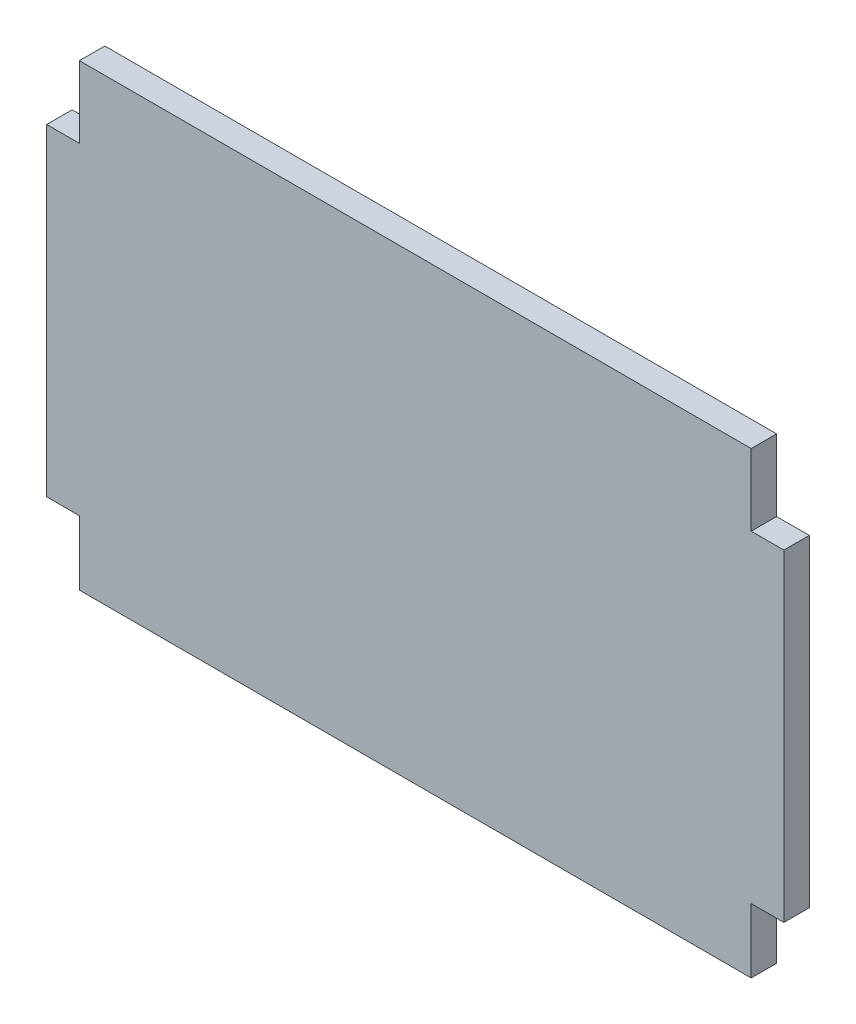
ISO-10303-21;
HEADER;
FILE_DESCRIPTION(('STEP AP214'),'2;1');
FILE_NAME('part.step','',(''),(''),'','','');
FILE_SCHEMA(('AUTOMOTIVE_DESIGN { 1 0 10303 214 1 1 1 1 }'));
ENDSEC;
DATA;
#1=APPLICATION_CONTEXT('core data for automotive mechanical design processes');
#2=APPLICATION_PROTOCOL_DEFINITION('international standard','automotive_design',2000,#1);
#3=PRODUCT_CONTEXT('',#1,'mechanical');
#4=PRODUCT('Part','Part','',(#3));
#5=PRODUCT_RELATED_PRODUCT_CATEGORY('part','',(#4));
#6=PRODUCT_DEFINITION_FORMATION('','',#4);
#7=PRODUCT_DEFINITION_CONTEXT('part definition',#1,'design');
#8=PRODUCT_DEFINITION('design','',#6,#7);
#9=PRODUCT_DEFINITION_SHAPE('','',#8);
#10=(LENGTH_UNIT() NAMED_UNIT(*) SI_UNIT(.MILLI.,.METRE.));
#11=(NAMED_UNIT(*) PLANE_ANGLE_UNIT() SI_UNIT($,.RADIAN.));
#12=(NAMED_UNIT(*) SI_UNIT($,.STERADIAN.) SOLID_ANGLE_UNIT());
#13=UNCERTAINTY_MEASURE_WITH_UNIT(LENGTH_MEASURE(1.E-05),#10,'distance_accuracy_value','');
#14=(GEOMETRIC_REPRESENTATION_CONTEXT(3) GLOBAL_UNCERTAINTY_ASSIGNED_CONTEXT((#13)) GLOBAL_UNIT_ASSIGNED_CONTEXT((#10,
#11,#12)) REPRESENTATION_CONTEXT('',''));
#15=CARTESIAN_POINT('',(0.,0.,0.));
#16=DIRECTION('',(0.,0.,1.));
#17=DIRECTION('',(1.,0.,0.));
#18=AXIS2_PLACEMENT_3D('',#15,#16,#17);
#19=CARTESIAN_POINT('',(-79.0312101910828,49.1611464968153,7.));
#20=DIRECTION('',(1.,0.,0.));
#21=DIRECTION('',(0.,0.,-1.));
#22=AXIS2_PLACEMENT_3D('',#19,#20,#21);
#23=PLANE('',#22);
#24=DIRECTION('',(0.,-1.,0.));
#25=VECTOR('',#24,1.);
#26=CARTESIAN_POINT('',(-79.0312101910828,49.1611464968153,0.));
#27=LINE('',#26,#25);
#28=CARTESIAN_POINT('',(-79.0312101910828,29.4234534047649,0.));
#29=VERTEX_POINT('',#28);
#30=CARTESIAN_POINT('',(-79.0312101910828,-59.4765465952351,0.));
#31=VERTEX_POINT('',#30);
#32=EDGE_CURVE('E205',#29,#31,#27,.T.);
#33=ORIENTED_EDGE('',*,*,#32,.T.);
#34=DIRECTION('',(0.,0.,1.));
#35=VECTOR('',#34,1.);
#36=CARTESIAN_POINT('',(-79.0312101910828,-59.4765465952351,-21.6927759541275));
#37=LINE('',#36,#35);
#38=CARTESIAN_POINT('',(-79.0312101910828,-59.4765465952351,7.));
#39=VERTEX_POINT('',#38);
#40=EDGE_CURVE('E252',#31,#39,#37,.T.);
#41=ORIENTED_EDGE('',*,*,#40,.T.);
#42=DIRECTION('',(0.,-1.,0.));
#43=VECTOR('',#42,1.);
#44=CARTESIAN_POINT('',(-79.0312101910828,49.1611464968153,7.));
#45=LINE('',#44,#43);
#46=CARTESIAN_POINT('',(-79.0312101910828,29.4234534047649,7.));
#47=VERTEX_POINT('',#46);
#48=EDGE_CURVE('E206',#47,#39,#45,.T.);
#49=ORIENTED_EDGE('',*,*,#48,.F.);
#50=DIRECTION('',(0.,0.,1.));
#51=VECTOR('',#50,1.);
#52=CARTESIAN_POINT('',(-79.0312101910828,29.4234534047649,-21.6927759541275));
#53=LINE('',#52,#51);
#54=EDGE_CURVE('E147',#29,#47,#53,.T.);
#55=ORIENTED_EDGE('',*,*,#54,.F.);
#56=EDGE_LOOP('',(#33,#41,#49,#55));
#57=FACE_BOUND('',#56,.T.);
#58=ADVANCED_FACE('F37',(#57),#23,.F.);
#59=CARTESIAN_POINT('',(-79.0312101910828,-77.2388535031847,7.));
#60=DIRECTION('',(0.,1.,0.));
#61=DIRECTION('',(0.,0.,1.));
#62=AXIS2_PLACEMENT_3D('',#59,#60,#61);
#63=PLANE('',#62);
#64=DIRECTION('',(1.,0.,0.));
#65=VECTOR('',#64,1.);
#66=CARTESIAN_POINT('',(-79.0312101910828,-77.2388535031847,7.));
#67=LINE('',#66,#65);
#68=CARTESIAN_POINT('',(-70.0312101910829,-77.2388535031847,7.));
#69=VERTEX_POINT('',#68);
#70=CARTESIAN_POINT('',(115.168789808917,-77.2388535031847,7.));
#71=VERTEX_POINT('',#70);
#72=EDGE_CURVE('E210',#69,#71,#67,.T.);
#73=ORIENTED_EDGE('',*,*,#72,.F.);
#74=DIRECTION('',(0.,0.,1.));
#75=VECTOR('',#74,1.);
#76=CARTESIAN_POINT('',(-70.0312101910829,-77.2388535031847,-21.6927759541275));
#77=LINE('',#76,#75);
#78=CARTESIAN_POINT('',(-70.0312101910829,-77.2388535031847,0.));
#79=VERTEX_POINT('',#78);
#80=EDGE_CURVE('E256',#79,#69,#77,.T.);
#81=ORIENTED_EDGE('',*,*,#80,.F.);
#82=DIRECTION('',(1.,0.,0.));
#83=VECTOR('',#82,1.);
#84=CARTESIAN_POINT('',(-79.0312101910828,-77.2388535031847,0.));
#85=LINE('',#84,#83);
#86=CARTESIAN_POINT('',(115.168789808917,-77.2388535031847,0.));
#87=VERTEX_POINT('',#86);
#88=EDGE_CURVE('E219',#79,#87,#85,.T.);
#89=ORIENTED_EDGE('',*,*,#88,.T.);
#90=DIRECTION('',(0.,0.,1.));
#91=VECTOR('',#90,1.);
#92=CARTESIAN_POINT('',(115.168789808917,-77.2388535031847,-21.6927759541275));
#93=LINE('',#92,#91);
#94=EDGE_CURVE('E185',#87,#71,#93,.T.);
#95=ORIENTED_EDGE('',*,*,#94,.T.);
#96=EDGE_LOOP('',(#73,#81,#89,#95));
#97=FACE_BOUND('',#96,.T.);
#98=ADVANCED_FACE('F290',(#97),#63,.F.);
#99=CARTESIAN_POINT('',(124.168789808917,49.1611464968153,7.));
#100=DIRECTION('',(-1.,0.,0.));
#101=DIRECTION('',(0.,-1.,0.));
#102=AXIS2_PLACEMENT_3D('',#99,#100,#101);
#103=PLANE('',#102);
#104=DIRECTION('',(0.,1.,0.));
#105=VECTOR('',#104,1.);
#106=CARTESIAN_POINT('',(124.168789808917,49.1611464968153,0.));
#107=LINE('',#106,#105);
#108=CARTESIAN_POINT('',(124.168789808917,-59.4765465952351,0.));
#109=VERTEX_POINT('',#108);
#110=CARTESIAN_POINT('',(124.168789808917,29.4234534047649,0.));
#111=VERTEX_POINT('',#110);
#112=EDGE_CURVE('E222',#109,#111,#107,.T.);
#113=ORIENTED_EDGE('',*,*,#112,.T.);
#114=DIRECTION('',(0.,0.,1.));
#115=VECTOR('',#114,1.);
#116=CARTESIAN_POINT('',(124.168789808917,29.4234534047649,-21.6927759541275));
#117=LINE('',#116,#115);
#118=CARTESIAN_POINT('',(124.168789808917,29.4234534047649,7.));
#119=VERTEX_POINT('',#118);
#120=EDGE_CURVE('E172',#111,#119,#117,.T.);
#121=ORIENTED_EDGE('',*,*,#120,.T.);
#122=DIRECTION('',(0.,1.,0.));
#123=VECTOR('',#122,1.);
#124=CARTESIAN_POINT('',(124.168789808917,49.1611464968153,7.));
#125=LINE('',#124,#123);
#126=CARTESIAN_POINT('',(124.168789808917,-59.4765465952351,7.));
#127=VERTEX_POINT('',#126);
#128=EDGE_CURVE('E46',#127,#119,#125,.T.);
#129=ORIENTED_EDGE('',*,*,#128,.F.);
#130=DIRECTION('',(0.,0.,1.));
#131=VECTOR('',#130,1.);
#132=CARTESIAN_POINT('',(124.168789808917,-59.4765465952351,-21.6927759541275));
#133=LINE('',#132,#131);
#134=EDGE_CURVE('E194',#109,#127,#133,.T.);
#135=ORIENTED_EDGE('',*,*,#134,.F.);
#136=EDGE_LOOP('',(#113,#121,#129,#135));
#137=FACE_BOUND('',#136,.T.);
#138=ADVANCED_FACE('F232',(#137),#103,.F.);
#139=CARTESIAN_POINT('',(-79.0312101910828,49.1611464968153,7.));
#140=DIRECTION('',(0.,-1.,0.));
#141=DIRECTION('',(0.,0.,-1.));
#142=AXIS2_PLACEMENT_3D('',#139,#140,#141);
#143=PLANE('',#142);
#144=DIRECTION('',(-1.,0.,0.));
#145=VECTOR('',#144,1.);
#146=CARTESIAN_POINT('',(-79.0312101910828,49.1611464968153,7.));
#147=LINE('',#146,#145);
#148=CARTESIAN_POINT('',(115.168789808917,49.1611464968153,7.));
#149=VERTEX_POINT('',#148);
#150=CARTESIAN_POINT('',(-70.0312101910828,49.1611464968153,7.));
#151=VERTEX_POINT('',#150);
#152=EDGE_CURVE('E11',#149,#151,#147,.T.);
#153=ORIENTED_EDGE('',*,*,#152,.F.);
#154=DIRECTION('',(0.,0.,1.));
#155=VECTOR('',#154,1.);
#156=CARTESIAN_POINT('',(115.168789808917,49.1611464968153,-21.6927759541275));
#157=LINE('',#156,#155);
#158=CARTESIAN_POINT('',(115.168789808917,49.1611464968153,0.));
#159=VERTEX_POINT('',#158);
#160=EDGE_CURVE('E163',#159,#149,#157,.T.);
#161=ORIENTED_EDGE('',*,*,#160,.F.);
#162=DIRECTION('',(-1.,0.,0.));
#163=VECTOR('',#162,1.);
#164=CARTESIAN_POINT('',(-79.0312101910828,49.1611464968153,0.));
#165=LINE('',#164,#163);
#166=CARTESIAN_POINT('',(-70.0312101910828,49.1611464968153,0.));
#167=VERTEX_POINT('',#166);
#168=EDGE_CURVE('E40',#159,#167,#165,.T.);
#169=ORIENTED_EDGE('',*,*,#168,.T.);
#170=DIRECTION('',(0.,0.,1.));
#171=VECTOR('',#170,1.);
#172=CARTESIAN_POINT('',(-70.0312101910828,49.1611464968153,-21.6927759541275));
#173=LINE('',#172,#171);
#174=EDGE_CURVE('E131',#167,#151,#173,.T.);
#175=ORIENTED_EDGE('',*,*,#174,.T.);
#176=EDGE_LOOP('',(#153,#161,#169,#175));
#177=FACE_BOUND('',#176,.T.);
#178=ADVANCED_FACE('F143',(#177),#143,.F.);
#179=CARTESIAN_POINT('',(0.,0.,7.));
#180=DIRECTION('',(0.,0.,1.));
#181=DIRECTION('',(1.,0.,0.));
#182=AXIS2_PLACEMENT_3D('',#179,#180,#181);
#183=PLANE('',#182);
#184=DIRECTION('',(-1.,0.,0.));
#185=VECTOR('',#184,1.);
#186=CARTESIAN_POINT('',(-70.0312101910828,-59.4765465952351,7.));
#187=LINE('',#186,#185);
#188=CARTESIAN_POINT('',(-70.0312101910828,-59.4765465952351,7.));
#189=VERTEX_POINT('',#188);
#190=EDGE_CURVE('E243',#189,#39,#187,.T.);
#191=ORIENTED_EDGE('',*,*,#190,.F.);
#192=DIRECTION('',(0.,1.,0.));
#193=VECTOR('',#192,1.);
#194=CARTESIAN_POINT('',(-70.0312101910828,-59.4765465952351,7.));
#195=LINE('',#194,#193);
#196=EDGE_CURVE('E247',#69,#189,#195,.T.);
#197=ORIENTED_EDGE('',*,*,#196,.F.);
#198=ORIENTED_EDGE('',*,*,#72,.T.);
#199=DIRECTION('',(0.,-1.,0.));
#200=VECTOR('',#199,1.);
#201=CARTESIAN_POINT('',(115.168789808917,-59.4765465952351,7.));
#202=LINE('',#201,#200);
#203=CARTESIAN_POINT('',(115.168789808917,-59.4765465952351,7.));
#204=VERTEX_POINT('',#203);
#205=EDGE_CURVE('E190',#204,#71,#202,.T.);
#206=ORIENTED_EDGE('',*,*,#205,.F.);
#207=DIRECTION('',(-1.,0.,0.));
#208=VECTOR('',#207,1.);
#209=CARTESIAN_POINT('',(115.168789808917,-59.4765465952351,7.));
#210=LINE('',#209,#208);
#211=EDGE_CURVE('E186',#127,#204,#210,.T.);
#212=ORIENTED_EDGE('',*,*,#211,.F.);
#213=ORIENTED_EDGE('',*,*,#128,.T.);
#214=DIRECTION('',(1.,0.,0.));
#215=VECTOR('',#214,1.);
#216=CARTESIAN_POINT('',(115.168789808917,29.4234534047649,7.));
#217=LINE('',#216,#215);
#218=CARTESIAN_POINT('',(115.168789808917,29.4234534047649,7.));
#219=VERTEX_POINT('',#218);
#220=EDGE_CURVE('E155',#219,#119,#217,.T.);
#221=ORIENTED_EDGE('',*,*,#220,.F.);
#222=DIRECTION('',(0.,-1.,0.));
#223=VECTOR('',#222,1.);
#224=CARTESIAN_POINT('',(115.168789808917,29.4234534047649,7.));
#225=LINE('',#224,#223);
#226=EDGE_CURVE('E153',#149,#219,#225,.T.);
#227=ORIENTED_EDGE('',*,*,#226,.F.);
#228=ORIENTED_EDGE('',*,*,#152,.T.);
#229=DIRECTION('',(0.,1.,0.));
#230=VECTOR('',#229,1.);
#231=CARTESIAN_POINT('',(-70.0312101910828,29.4234534047649,7.));
#232=LINE('',#231,#230);
#233=CARTESIAN_POINT('',(-70.0312101910828,29.4234534047649,7.));
#234=VERTEX_POINT('',#233);
#235=EDGE_CURVE('E127',#234,#151,#232,.T.);
#236=ORIENTED_EDGE('',*,*,#235,.F.);
#237=DIRECTION('',(1.,0.,0.));
#238=VECTOR('',#237,1.);
#239=CARTESIAN_POINT('',(-70.0312101910828,29.4234534047649,7.));
#240=LINE('',#239,#238);
#241=EDGE_CURVE('E138',#47,#234,#240,.T.);
#242=ORIENTED_EDGE('',*,*,#241,.F.);
#243=ORIENTED_EDGE('',*,*,#48,.T.);
#244=EDGE_LOOP('',(#191,#197,#198,#206,#212,#213,#221,#227,#228,#236,#242,#243));
#245=FACE_BOUND('',#244,.T.);
#246=ADVANCED_FACE('F151',(#245),#183,.T.);
#247=CARTESIAN_POINT('',(0.,0.,0.));
#248=DIRECTION('',(0.,0.,1.));
#249=DIRECTION('',(1.,0.,0.));
#250=AXIS2_PLACEMENT_3D('',#247,#248,#249);
#251=PLANE('',#250);
#252=DIRECTION('',(0.,-1.,0.));
#253=VECTOR('',#252,1.);
#254=CARTESIAN_POINT('',(-70.0312101910828,-59.4765465952351,0.));
#255=LINE('',#254,#253);
#256=CARTESIAN_POINT('',(-70.0312101910828,-59.4765465952351,0.));
#257=VERTEX_POINT('',#256);
#258=EDGE_CURVE('E261',#257,#79,#255,.T.);
#259=ORIENTED_EDGE('',*,*,#258,.F.);
#260=DIRECTION('',(1.,0.,0.));
#261=VECTOR('',#260,1.);
#262=CARTESIAN_POINT('',(-70.0312101910828,-59.4765465952351,0.));
#263=LINE('',#262,#261);
#264=EDGE_CURVE('E191',#31,#257,#263,.T.);
#265=ORIENTED_EDGE('',*,*,#264,.F.);
#266=ORIENTED_EDGE('',*,*,#32,.F.);
#267=DIRECTION('',(-1.,0.,0.));
#268=VECTOR('',#267,1.);
#269=CARTESIAN_POINT('',(-70.0312101910828,29.4234534047649,0.));
#270=LINE('',#269,#268);
#271=CARTESIAN_POINT('',(-70.0312101910828,29.4234534047649,0.));
#272=VERTEX_POINT('',#271);
#273=EDGE_CURVE('E166',#272,#29,#270,.T.);
#274=ORIENTED_EDGE('',*,*,#273,.F.);
#275=DIRECTION('',(0.,-1.,0.));
#276=VECTOR('',#275,1.);
#277=CARTESIAN_POINT('',(-70.0312101910828,29.4234534047649,0.));
#278=LINE('',#277,#276);
#279=EDGE_CURVE('E157',#167,#272,#278,.T.);
#280=ORIENTED_EDGE('',*,*,#279,.F.);
#281=ORIENTED_EDGE('',*,*,#168,.F.);
#282=DIRECTION('',(0.,1.,0.));
#283=VECTOR('',#282,1.);
#284=CARTESIAN_POINT('',(115.168789808917,29.4234534047649,0.));
#285=LINE('',#284,#283);
#286=CARTESIAN_POINT('',(115.168789808917,29.4234534047649,0.));
#287=VERTEX_POINT('',#286);
#288=EDGE_CURVE('E176',#287,#159,#285,.T.);
#289=ORIENTED_EDGE('',*,*,#288,.F.);
#290=DIRECTION('',(-1.,0.,0.));
#291=VECTOR('',#290,1.);
#292=CARTESIAN_POINT('',(115.168789808917,29.4234534047649,0.));
#293=LINE('',#292,#291);
#294=EDGE_CURVE('E169',#111,#287,#293,.T.);
#295=ORIENTED_EDGE('',*,*,#294,.F.);
#296=ORIENTED_EDGE('',*,*,#112,.F.);
#297=DIRECTION('',(1.,0.,0.));
#298=VECTOR('',#297,1.);
#299=CARTESIAN_POINT('',(115.168789808917,-59.4765465952351,0.));
#300=LINE('',#299,#298);
#301=CARTESIAN_POINT('',(115.168789808917,-59.4765465952351,0.));
#302=VERTEX_POINT('',#301);
#303=EDGE_CURVE('E184',#302,#109,#300,.T.);
#304=ORIENTED_EDGE('',*,*,#303,.F.);
#305=DIRECTION('',(0.,1.,0.));
#306=VECTOR('',#305,1.);
#307=CARTESIAN_POINT('',(115.168789808917,-59.4765465952351,0.));
#308=LINE('',#307,#306);
#309=EDGE_CURVE('E180',#87,#302,#308,.T.);
#310=ORIENTED_EDGE('',*,*,#309,.F.);
#311=ORIENTED_EDGE('',*,*,#88,.F.);
#312=EDGE_LOOP('',(#259,#265,#266,#274,#280,#281,#289,#295,#296,#304,#310,#311));
#313=FACE_BOUND('',#312,.T.);
#314=ADVANCED_FACE('F238',(#313),#251,.F.);
#315=CARTESIAN_POINT('',(115.168789808917,-59.4765465952351,-21.6927759541275));
#316=DIRECTION('',(-1.,0.,0.));
#317=DIRECTION('',(0.,0.,1.));
#318=AXIS2_PLACEMENT_3D('',#315,#316,#317);
#319=PLANE('',#318);
#320=ORIENTED_EDGE('',*,*,#309,.T.);
#321=DIRECTION('',(0.,0.,1.));
#322=VECTOR('',#321,1.);
#323=CARTESIAN_POINT('',(115.168789808917,-59.4765465952351,-21.6927759541275));
#324=LINE('',#323,#322);
#325=EDGE_CURVE('E198',#302,#204,#324,.T.);
#326=ORIENTED_EDGE('',*,*,#325,.T.);
#327=ORIENTED_EDGE('',*,*,#205,.T.);
#328=ORIENTED_EDGE('',*,*,#94,.F.);
#329=EDGE_LOOP('',(#320,#326,#327,#328));
#330=FACE_BOUND('',#329,.T.);
#331=ADVANCED_FACE('F292',(#330),#319,.F.);
#332=CARTESIAN_POINT('',(115.168789808917,-59.4765465952351,-21.6927759541275));
#333=DIRECTION('',(0.,1.,0.));
#334=DIRECTION('',(-1.,0.,0.));
#335=AXIS2_PLACEMENT_3D('',#332,#333,#334);
#336=PLANE('',#335);
#337=ORIENTED_EDGE('',*,*,#303,.T.);
#338=ORIENTED_EDGE('',*,*,#134,.T.);
#339=ORIENTED_EDGE('',*,*,#211,.T.);
#340=ORIENTED_EDGE('',*,*,#325,.F.);
#341=EDGE_LOOP('',(#337,#338,#339,#340));
#342=FACE_BOUND('',#341,.T.);
#343=ADVANCED_FACE('F295',(#342),#336,.F.);
#344=CARTESIAN_POINT('',(-70.0312101910828,29.4234534047649,-21.6927759541275));
#345=DIRECTION('',(1.,0.,0.));
#346=DIRECTION('',(0.,0.,-1.));
#347=AXIS2_PLACEMENT_3D('',#344,#345,#346);
#348=PLANE('',#347);
#349=ORIENTED_EDGE('',*,*,#279,.T.);
#350=DIRECTION('',(0.,0.,1.));
#351=VECTOR('',#350,1.);
#352=CARTESIAN_POINT('',(-70.0312101910828,29.4234534047649,-21.6927759541275));
#353=LINE('',#352,#351);
#354=EDGE_CURVE('E133',#272,#234,#353,.T.);
#355=ORIENTED_EDGE('',*,*,#354,.T.);
#356=ORIENTED_EDGE('',*,*,#235,.T.);
#357=ORIENTED_EDGE('',*,*,#174,.F.);
#358=EDGE_LOOP('',(#349,#355,#356,#357));
#359=FACE_BOUND('',#358,.T.);
#360=ADVANCED_FACE('F130',(#359),#348,.F.);
#361=CARTESIAN_POINT('',(-70.0312101910828,29.4234534047649,-21.6927759541275));
#362=DIRECTION('',(0.,-1.,0.));
#363=DIRECTION('',(1.,0.,0.));
#364=AXIS2_PLACEMENT_3D('',#361,#362,#363);
#365=PLANE('',#364);
#366=ORIENTED_EDGE('',*,*,#273,.T.);
#367=ORIENTED_EDGE('',*,*,#54,.T.);
#368=ORIENTED_EDGE('',*,*,#241,.T.);
#369=ORIENTED_EDGE('',*,*,#354,.F.);
#370=EDGE_LOOP('',(#366,#367,#368,#369));
#371=FACE_BOUND('',#370,.T.);
#372=ADVANCED_FACE('F277',(#371),#365,.F.);
#373=CARTESIAN_POINT('',(115.168789808917,29.4234534047649,-21.6927759541275));
#374=DIRECTION('',(0.,-1.,0.));
#375=DIRECTION('',(1.,0.,0.));
#376=AXIS2_PLACEMENT_3D('',#373,#374,#375);
#377=PLANE('',#376);
#378=ORIENTED_EDGE('',*,*,#294,.T.);
#379=DIRECTION('',(0.,0.,1.));
#380=VECTOR('',#379,1.);
#381=CARTESIAN_POINT('',(115.168789808917,29.4234534047649,-21.6927759541275));
#382=LINE('',#381,#380);
#383=EDGE_CURVE('E62',#287,#219,#382,.T.);
#384=ORIENTED_EDGE('',*,*,#383,.T.);
#385=ORIENTED_EDGE('',*,*,#220,.T.);
#386=ORIENTED_EDGE('',*,*,#120,.F.);
#387=EDGE_LOOP('',(#378,#384,#385,#386));
#388=FACE_BOUND('',#387,.T.);
#389=ADVANCED_FACE('F352',(#388),#377,.F.);
#390=CARTESIAN_POINT('',(115.168789808917,29.4234534047649,-21.6927759541275));
#391=DIRECTION('',(-1.,0.,0.));
#392=DIRECTION('',(0.,0.,1.));
#393=AXIS2_PLACEMENT_3D('',#390,#391,#392);
#394=PLANE('',#393);
#395=ORIENTED_EDGE('',*,*,#288,.T.);
#396=ORIENTED_EDGE('',*,*,#160,.T.);
#397=ORIENTED_EDGE('',*,*,#226,.T.);
#398=ORIENTED_EDGE('',*,*,#383,.F.);
#399=EDGE_LOOP('',(#395,#396,#397,#398));
#400=FACE_BOUND('',#399,.T.);
#401=ADVANCED_FACE('F362',(#400),#394,.F.);
#402=CARTESIAN_POINT('',(-70.0312101910828,-59.4765465952351,-21.6927759541275));
#403=DIRECTION('',(0.,1.,0.));
#404=DIRECTION('',(-1.,0.,0.));
#405=AXIS2_PLACEMENT_3D('',#402,#403,#404);
#406=PLANE('',#405);
#407=ORIENTED_EDGE('',*,*,#264,.T.);
#408=DIRECTION('',(0.,0.,1.));
#409=VECTOR('',#408,1.);
#410=CARTESIAN_POINT('',(-70.0312101910828,-59.4765465952351,-21.6927759541275));
#411=LINE('',#410,#409);
#412=EDGE_CURVE('E54',#257,#189,#411,.T.);
#413=ORIENTED_EDGE('',*,*,#412,.T.);
#414=ORIENTED_EDGE('',*,*,#190,.T.);
#415=ORIENTED_EDGE('',*,*,#40,.F.);
#416=EDGE_LOOP('',(#407,#413,#414,#415));
#417=FACE_BOUND('',#416,.T.);
#418=ADVANCED_FACE('F284',(#417),#406,.F.);
#419=CARTESIAN_POINT('',(-70.0312101910828,-59.4765465952351,-21.6927759541275));
#420=DIRECTION('',(1.,0.,0.));
#421=DIRECTION('',(0.,1.,0.));
#422=AXIS2_PLACEMENT_3D('',#419,#420,#421);
#423=PLANE('',#422);
#424=ORIENTED_EDGE('',*,*,#258,.T.);
#425=ORIENTED_EDGE('',*,*,#80,.T.);
#426=ORIENTED_EDGE('',*,*,#196,.T.);
#427=ORIENTED_EDGE('',*,*,#412,.F.);
#428=EDGE_LOOP('',(#424,#425,#426,#427));
#429=FACE_BOUND('',#428,.T.);
#430=ADVANCED_FACE('F381',(#429),#423,.F.);
#431=CLOSED_SHELL('',(#58,#98,#138,#178,#246,#314,#331,#343,#360,#372,#389,#401,#418,#430));
#432=MANIFOLD_SOLID_BREP('B2',#431);
#433=ADVANCED_BREP_SHAPE_REPRESENTATION('',(#18,#432),#14);
#434=SHAPE_DEFINITION_REPRESENTATION(#9,#433);
ENDSEC;
END-ISO-10303-21;
